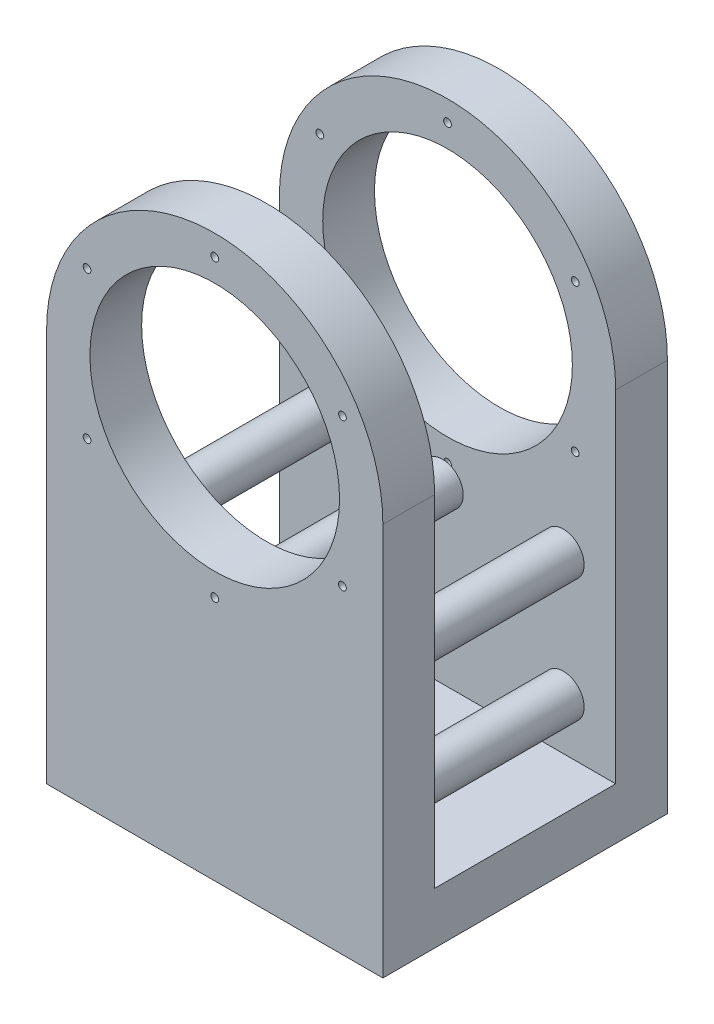
ISO-10303-21;
HEADER;
FILE_DESCRIPTION(('STEP AP214'),'2;1');
FILE_NAME('part.step','',(''),(''),'','','');
FILE_SCHEMA(('AUTOMOTIVE_DESIGN { 1 0 10303 214 1 1 1 1 }'));
ENDSEC;
DATA;
#1=APPLICATION_CONTEXT('core data for automotive mechanical design processes');
#2=APPLICATION_PROTOCOL_DEFINITION('international standard','automotive_design',2000,#1);
#3=PRODUCT_CONTEXT('',#1,'mechanical');
#4=PRODUCT('Part','Part','',(#3));
#5=PRODUCT_RELATED_PRODUCT_CATEGORY('part','',(#4));
#6=PRODUCT_DEFINITION_FORMATION('','',#4);
#7=PRODUCT_DEFINITION_CONTEXT('part definition',#1,'design');
#8=PRODUCT_DEFINITION('design','',#6,#7);
#9=PRODUCT_DEFINITION_SHAPE('','',#8);
#10=(LENGTH_UNIT() NAMED_UNIT(*) SI_UNIT(.MILLI.,.METRE.));
#11=(NAMED_UNIT(*) PLANE_ANGLE_UNIT() SI_UNIT($,.RADIAN.));
#12=(NAMED_UNIT(*) SI_UNIT($,.STERADIAN.) SOLID_ANGLE_UNIT());
#13=UNCERTAINTY_MEASURE_WITH_UNIT(LENGTH_MEASURE(1.E-05),#10,'distance_accuracy_value','');
#14=(GEOMETRIC_REPRESENTATION_CONTEXT(3) GLOBAL_UNCERTAINTY_ASSIGNED_CONTEXT((#13)) GLOBAL_UNIT_ASSIGNED_CONTEXT((#10,
#11,#12)) REPRESENTATION_CONTEXT('',''));
#15=CARTESIAN_POINT('',(0.,0.,0.));
#16=DIRECTION('',(0.,0.,1.));
#17=DIRECTION('',(1.,0.,0.));
#18=AXIS2_PLACEMENT_3D('',#15,#16,#17);
#19=CARTESIAN_POINT('',(0.,-103.525908009908,20.));
#20=DIRECTION('',(0.,0.,1.));
#21=DIRECTION('',(1.,0.,0.));
#22=AXIS2_PLACEMENT_3D('',#19,#20,#21);
#23=PLANE('',#22);
#24=CARTESIAN_POINT('',(0.,177.208570031155,20.));
#25=DIRECTION('',(0.,0.,-1.));
#26=DIRECTION('',(-1.,0.,0.));
#27=AXIS2_PLACEMENT_3D('',#24,#25,#26);
#28=CIRCLE('',#27,1.5);
#29=CARTESIAN_POINT('',(-1.5,177.208570031155,20.));
#30=VERTEX_POINT('',#29);
#31=EDGE_CURVE('E739',#30,#30,#28,.T.);
#32=ORIENTED_EDGE('',*,*,#31,.T.);
#33=EDGE_LOOP('',(#32));
#34=FACE_BOUND('',#33,.T.);
#35=CARTESIAN_POINT('',(49.3634480157114,148.708570031153,20.));
#36=DIRECTION('',(0.,0.,-1.));
#37=DIRECTION('',(-1.,0.,0.));
#38=AXIS2_PLACEMENT_3D('',#35,#36,#37);
#39=CIRCLE('',#38,1.5);
#40=CARTESIAN_POINT('',(47.8634480157114,148.708570031153,20.));
#41=VERTEX_POINT('',#40);
#42=EDGE_CURVE('E791',#41,#41,#39,.T.);
#43=ORIENTED_EDGE('',*,*,#42,.T.);
#44=EDGE_LOOP('',(#43));
#45=FACE_BOUND('',#44,.T.);
#46=CARTESIAN_POINT('',(49.3634480157096,91.7085700311531,20.));
#47=DIRECTION('',(0.,0.,-1.));
#48=DIRECTION('',(-1.,0.,0.));
#49=AXIS2_PLACEMENT_3D('',#46,#47,#48);
#50=CIRCLE('',#49,1.5);
#51=CARTESIAN_POINT('',(47.8634480157096,91.7085700311531,20.));
#52=VERTEX_POINT('',#51);
#53=EDGE_CURVE('E758',#52,#52,#50,.T.);
#54=ORIENTED_EDGE('',*,*,#53,.T.);
#55=EDGE_LOOP('',(#54));
#56=FACE_BOUND('',#55,.T.);
#57=CARTESIAN_POINT('',(-4.43416149295041E-12,63.2085700311548,20.));
#58=DIRECTION('',(0.,0.,-1.));
#59=DIRECTION('',(-1.,0.,0.));
#60=AXIS2_PLACEMENT_3D('',#57,#58,#59);
#61=CIRCLE('',#60,1.5);
#62=CARTESIAN_POINT('',(-1.50000000000444,63.2085700311548,20.));
#63=VERTEX_POINT('',#62);
#64=EDGE_CURVE('E767',#63,#63,#61,.T.);
#65=ORIENTED_EDGE('',*,*,#64,.T.);
#66=EDGE_LOOP('',(#65));
#67=FACE_BOUND('',#66,.T.);
#68=CARTESIAN_POINT('',(-49.3634480157165,91.7085700311566,20.));
#69=DIRECTION('',(0.,0.,-1.));
#70=DIRECTION('',(-1.,0.,0.));
#71=AXIS2_PLACEMENT_3D('',#68,#69,#70);
#72=CIRCLE('',#71,1.50000000000002);
#73=CARTESIAN_POINT('',(-50.8634480157165,91.7085700311566,20.));
#74=VERTEX_POINT('',#73);
#75=EDGE_CURVE('E774',#74,#74,#72,.T.);
#76=ORIENTED_EDGE('',*,*,#75,.T.);
#77=EDGE_LOOP('',(#76));
#78=FACE_BOUND('',#77,.T.);
#79=CARTESIAN_POINT('',(-49.3634480157143,148.708570031157,20.));
#80=DIRECTION('',(0.,0.,-1.));
#81=DIRECTION('',(-1.,0.,0.));
#82=AXIS2_PLACEMENT_3D('',#79,#80,#81);
#83=CIRCLE('',#82,1.49999999999999);
#84=CARTESIAN_POINT('',(-50.8634480157142,148.708570031157,20.));
#85=VERTEX_POINT('',#84);
#86=EDGE_CURVE('E782',#85,#85,#83,.T.);
#87=ORIENTED_EDGE('',*,*,#86,.T.);
#88=EDGE_LOOP('',(#87));
#89=FACE_BOUND('',#88,.T.);
#90=CARTESIAN_POINT('',(0.,120.208570031155,20.));
#91=DIRECTION('',(0.,0.,1.));
#92=DIRECTION('',(1.,0.,0.));
#93=AXIS2_PLACEMENT_3D('',#90,#91,#92);
#94=CIRCLE('',#93,48.25);
#95=CARTESIAN_POINT('',(48.25,120.208570031155,20.));
#96=VERTEX_POINT('',#95);
#97=EDGE_CURVE('E175',#96,#96,#94,.T.);
#98=ORIENTED_EDGE('',*,*,#97,.F.);
#99=EDGE_LOOP('',(#98));
#100=FACE_BOUND('',#99,.T.);
#101=DIRECTION('',(0.,-1.,0.));
#102=VECTOR('',#101,1.);
#103=CARTESIAN_POINT('',(-65.,-103.525908009908,20.));
#104=LINE('',#103,#102);
#105=CARTESIAN_POINT('',(-65.,120.208570031155,20.));
#106=VERTEX_POINT('',#105);
#107=CARTESIAN_POINT('',(-65.,-31.65707978,20.));
#108=VERTEX_POINT('',#107);
#109=EDGE_CURVE('E190',#106,#108,#104,.T.);
#110=ORIENTED_EDGE('',*,*,#109,.T.);
#111=DIRECTION('',(1.,0.,0.));
#112=VECTOR('',#111,1.);
#113=CARTESIAN_POINT('',(0.,-31.65707978,20.));
#114=LINE('',#113,#112);
#115=CARTESIAN_POINT('',(65.,-31.65707978,20.));
#116=VERTEX_POINT('',#115);
#117=EDGE_CURVE('E253',#108,#116,#114,.T.);
#118=ORIENTED_EDGE('',*,*,#117,.T.);
#119=DIRECTION('',(0.,1.,0.));
#120=VECTOR('',#119,1.);
#121=CARTESIAN_POINT('',(65.,-103.525908009908,20.));
#122=LINE('',#121,#120);
#123=CARTESIAN_POINT('',(65.,120.208570031155,20.));
#124=VERTEX_POINT('',#123);
#125=EDGE_CURVE('E183',#116,#124,#122,.T.);
#126=ORIENTED_EDGE('',*,*,#125,.T.);
#127=CARTESIAN_POINT('',(0.,120.208570031155,20.));
#128=DIRECTION('',(0.,0.,1.));
#129=DIRECTION('',(-1.,0.,0.));
#130=AXIS2_PLACEMENT_3D('',#127,#128,#129);
#131=CIRCLE('',#130,65.);
#132=EDGE_CURVE('E186',#124,#106,#131,.T.);
#133=ORIENTED_EDGE('',*,*,#132,.T.);
#134=EDGE_LOOP('',(#110,#118,#126,#133));
#135=FACE_BOUND('',#134,.T.);
#136=ADVANCED_FACE('F59',(#34,#45,#56,#67,#78,#89,#100,#135),#23,.T.);
#137=CARTESIAN_POINT('',(0.,-103.525908009908,0.));
#138=DIRECTION('',(0.,0.,1.));
#139=DIRECTION('',(1.,0.,0.));
#140=AXIS2_PLACEMENT_3D('',#137,#138,#139);
#141=PLANE('',#140);
#142=CARTESIAN_POINT('',(0.,177.208570031155,0.));
#143=DIRECTION('',(0.,0.,-1.));
#144=DIRECTION('',(-1.,0.,0.));
#145=AXIS2_PLACEMENT_3D('',#142,#143,#144);
#146=CIRCLE('',#145,1.5);
#147=CARTESIAN_POINT('',(-1.5,177.208570031155,0.));
#148=VERTEX_POINT('',#147);
#149=EDGE_CURVE('E790',#148,#148,#146,.T.);
#150=ORIENTED_EDGE('',*,*,#149,.F.);
#151=EDGE_LOOP('',(#150));
#152=FACE_BOUND('',#151,.T.);
#153=CARTESIAN_POINT('',(49.3634480157114,148.708570031153,0.));
#154=DIRECTION('',(0.,0.,-1.));
#155=DIRECTION('',(-1.,0.,0.));
#156=AXIS2_PLACEMENT_3D('',#153,#154,#155);
#157=CIRCLE('',#156,1.5);
#158=CARTESIAN_POINT('',(47.8634480157114,148.708570031153,0.));
#159=VERTEX_POINT('',#158);
#160=EDGE_CURVE('E763',#159,#159,#157,.T.);
#161=ORIENTED_EDGE('',*,*,#160,.F.);
#162=EDGE_LOOP('',(#161));
#163=FACE_BOUND('',#162,.T.);
#164=CARTESIAN_POINT('',(49.3634480157096,91.7085700311531,0.));
#165=DIRECTION('',(0.,0.,-1.));
#166=DIRECTION('',(-1.,0.,0.));
#167=AXIS2_PLACEMENT_3D('',#164,#165,#166);
#168=CIRCLE('',#167,1.5);
#169=CARTESIAN_POINT('',(47.8634480157096,91.7085700311531,0.));
#170=VERTEX_POINT('',#169);
#171=EDGE_CURVE('E762',#170,#170,#168,.T.);
#172=ORIENTED_EDGE('',*,*,#171,.F.);
#173=EDGE_LOOP('',(#172));
#174=FACE_BOUND('',#173,.T.);
#175=CARTESIAN_POINT('',(-49.3634480157165,91.7085700311566,0.));
#176=DIRECTION('',(0.,0.,-1.));
#177=DIRECTION('',(-1.,0.,0.));
#178=AXIS2_PLACEMENT_3D('',#175,#176,#177);
#179=CIRCLE('',#178,1.50000000000002);
#180=CARTESIAN_POINT('',(-50.8634480157165,91.7085700311566,0.));
#181=VERTEX_POINT('',#180);
#182=EDGE_CURVE('E778',#181,#181,#179,.T.);
#183=ORIENTED_EDGE('',*,*,#182,.F.);
#184=EDGE_LOOP('',(#183));
#185=FACE_BOUND('',#184,.T.);
#186=CARTESIAN_POINT('',(-49.3634480157143,148.708570031157,0.));
#187=DIRECTION('',(0.,0.,-1.));
#188=DIRECTION('',(-1.,0.,0.));
#189=AXIS2_PLACEMENT_3D('',#186,#187,#188);
#190=CIRCLE('',#189,1.49999999999999);
#191=CARTESIAN_POINT('',(-50.8634480157142,148.708570031157,0.));
#192=VERTEX_POINT('',#191);
#193=EDGE_CURVE('E786',#192,#192,#190,.T.);
#194=ORIENTED_EDGE('',*,*,#193,.F.);
#195=EDGE_LOOP('',(#194));
#196=FACE_BOUND('',#195,.T.);
#197=CARTESIAN_POINT('',(0.,120.208570031155,0.));
#198=DIRECTION('',(0.,0.,1.));
#199=DIRECTION('',(1.,0.,0.));
#200=AXIS2_PLACEMENT_3D('',#197,#198,#199);
#201=CIRCLE('',#200,48.25);
#202=CARTESIAN_POINT('',(48.25,120.208570031155,0.));
#203=VERTEX_POINT('',#202);
#204=EDGE_CURVE('E174',#203,#203,#201,.T.);
#205=ORIENTED_EDGE('',*,*,#204,.T.);
#206=EDGE_LOOP('',(#205));
#207=FACE_BOUND('',#206,.T.);
#208=CARTESIAN_POINT('',(44.8125688289735,55.5314901674792,0.));
#209=DIRECTION('',(0.,0.,1.));
#210=DIRECTION('',(1.,0.,0.));
#211=AXIS2_PLACEMENT_3D('',#208,#209,#210);
#212=CIRCLE('',#211,8.);
#213=CARTESIAN_POINT('',(52.8125688289735,55.5314901674792,0.));
#214=VERTEX_POINT('',#213);
#215=EDGE_CURVE('E210',#214,#214,#212,.F.);
#216=ORIENTED_EDGE('',*,*,#215,.F.);
#217=EDGE_LOOP('',(#216));
#218=FACE_BOUND('',#217,.T.);
#219=CARTESIAN_POINT('',(-48.6600829128466,55.5314901674792,0.));
#220=DIRECTION('',(0.,0.,1.));
#221=DIRECTION('',(1.,0.,0.));
#222=AXIS2_PLACEMENT_3D('',#219,#220,#221);
#223=CIRCLE('',#222,8.);
#224=CARTESIAN_POINT('',(-40.6600829128466,55.5314901674792,0.));
#225=VERTEX_POINT('',#224);
#226=EDGE_CURVE('E214',#225,#225,#223,.F.);
#227=ORIENTED_EDGE('',*,*,#226,.F.);
#228=EDGE_LOOP('',(#227));
#229=FACE_BOUND('',#228,.T.);
#230=CARTESIAN_POINT('',(-1.92375704193651,55.5314901674792,0.));
#231=DIRECTION('',(0.,0.,1.));
#232=DIRECTION('',(1.,0.,0.));
#233=AXIS2_PLACEMENT_3D('',#230,#231,#232);
#234=CIRCLE('',#233,8.);
#235=CARTESIAN_POINT('',(1.44035229725961,62.7897797975459,0.));
#236=VERTEX_POINT('',#235);
#237=CARTESIAN_POINT('',(-1.46763682096476,63.5184767296327,0.));
#238=VERTEX_POINT('',#237);
#239=EDGE_CURVE('E218',#236,#238,#234,.F.);
#240=ORIENTED_EDGE('',*,*,#239,.F.);
#241=CARTESIAN_POINT('',(-4.43416149295041E-12,63.2085700311548,0.));
#242=DIRECTION('',(0.,0.,-1.));
#243=DIRECTION('',(-1.,0.,0.));
#244=AXIS2_PLACEMENT_3D('',#241,#242,#243);
#245=CIRCLE('',#244,1.5);
#246=EDGE_CURVE('E81',#238,#236,#245,.T.);
#247=ORIENTED_EDGE('',*,*,#246,.F.);
#248=EDGE_LOOP('',(#240,#247));
#249=FACE_BOUND('',#248,.T.);
#250=CARTESIAN_POINT('',(44.8125688289736,7.9372051937396,0.));
#251=DIRECTION('',(0.,0.,1.));
#252=DIRECTION('',(1.,0.,0.));
#253=AXIS2_PLACEMENT_3D('',#250,#251,#252);
#254=CIRCLE('',#253,8.);
#255=CARTESIAN_POINT('',(52.8125688289736,7.9372051937396,0.));
#256=VERTEX_POINT('',#255);
#257=EDGE_CURVE('E68',#256,#256,#254,.F.);
#258=ORIENTED_EDGE('',*,*,#257,.F.);
#259=EDGE_LOOP('',(#258));
#260=FACE_BOUND('',#259,.T.);
#261=CARTESIAN_POINT('',(-48.6600829128466,7.9372051937396,0.));
#262=DIRECTION('',(0.,0.,1.));
#263=DIRECTION('',(1.,0.,0.));
#264=AXIS2_PLACEMENT_3D('',#261,#262,#263);
#265=CIRCLE('',#264,8.);
#266=CARTESIAN_POINT('',(-40.6600829128466,7.9372051937396,0.));
#267=VERTEX_POINT('',#266);
#268=EDGE_CURVE('E12',#267,#267,#265,.F.);
#269=ORIENTED_EDGE('',*,*,#268,.F.);
#270=EDGE_LOOP('',(#269));
#271=FACE_BOUND('',#270,.T.);
#272=DIRECTION('',(0.,1.,0.));
#273=VECTOR('',#272,1.);
#274=CARTESIAN_POINT('',(65.,-103.525908009908,0.));
#275=LINE('',#274,#273);
#276=CARTESIAN_POINT('',(65.,-11.65707978,0.));
#277=VERTEX_POINT('',#276);
#278=CARTESIAN_POINT('',(65.,120.208570031155,0.));
#279=VERTEX_POINT('',#278);
#280=EDGE_CURVE('E179',#277,#279,#275,.T.);
#281=ORIENTED_EDGE('',*,*,#280,.F.);
#282=DIRECTION('',(-1.,0.,0.));
#283=VECTOR('',#282,1.);
#284=CARTESIAN_POINT('',(65.,-11.65707978,0.));
#285=LINE('',#284,#283);
#286=CARTESIAN_POINT('',(-65.,-11.65707978,0.));
#287=VERTEX_POINT('',#286);
#288=EDGE_CURVE('E240',#277,#287,#285,.T.);
#289=ORIENTED_EDGE('',*,*,#288,.T.);
#290=DIRECTION('',(0.,-1.,0.));
#291=VECTOR('',#290,1.);
#292=CARTESIAN_POINT('',(-65.,-103.525908009908,0.));
#293=LINE('',#292,#291);
#294=CARTESIAN_POINT('',(-65.,120.208570031155,0.));
#295=VERTEX_POINT('',#294);
#296=EDGE_CURVE('E187',#295,#287,#293,.T.);
#297=ORIENTED_EDGE('',*,*,#296,.F.);
#298=CARTESIAN_POINT('',(0.,120.208570031155,0.));
#299=DIRECTION('',(0.,0.,1.));
#300=DIRECTION('',(-1.,0.,0.));
#301=AXIS2_PLACEMENT_3D('',#298,#299,#300);
#302=CIRCLE('',#301,65.);
#303=EDGE_CURVE('E197',#279,#295,#302,.T.);
#304=ORIENTED_EDGE('',*,*,#303,.F.);
#305=EDGE_LOOP('',(#281,#289,#297,#304));
#306=FACE_BOUND('',#305,.T.);
#307=ADVANCED_FACE('F228',(#152,#163,#174,#185,#196,#207,#218,#229,#249,#260,#271,#306),#141,.F.);
#308=CARTESIAN_POINT('',(0.,-103.525908009908,-90.));
#309=DIRECTION('',(0.,0.,-1.));
#310=DIRECTION('',(-1.,0.,0.));
#311=AXIS2_PLACEMENT_3D('',#308,#309,#310);
#312=PLANE('',#311);
#313=CARTESIAN_POINT('',(49.3634480157096,91.7085700311531,-90.));
#314=DIRECTION('',(0.,0.,1.));
#315=DIRECTION('',(1.,0.,0.));
#316=AXIS2_PLACEMENT_3D('',#313,#314,#315);
#317=CIRCLE('',#316,1.5);
#318=CARTESIAN_POINT('',(50.8634480157096,91.7085700311531,-90.));
#319=VERTEX_POINT('',#318);
#320=EDGE_CURVE('E812',#319,#319,#317,.T.);
#321=ORIENTED_EDGE('',*,*,#320,.T.);
#322=EDGE_LOOP('',(#321));
#323=FACE_BOUND('',#322,.T.);
#324=CARTESIAN_POINT('',(-49.3634480157165,91.7085700311566,-90.));
#325=DIRECTION('',(0.,0.,1.));
#326=DIRECTION('',(1.,0.,0.));
#327=AXIS2_PLACEMENT_3D('',#324,#325,#326);
#328=CIRCLE('',#327,1.50000000000002);
#329=CARTESIAN_POINT('',(-47.8634480157165,91.7085700311566,-90.));
#330=VERTEX_POINT('',#329);
#331=EDGE_CURVE('E820',#330,#330,#328,.T.);
#332=ORIENTED_EDGE('',*,*,#331,.T.);
#333=EDGE_LOOP('',(#332));
#334=FACE_BOUND('',#333,.T.);
#335=CARTESIAN_POINT('',(-4.43416149295041E-12,63.2085700311548,-90.));
#336=DIRECTION('',(0.,0.,1.));
#337=DIRECTION('',(1.,0.,0.));
#338=AXIS2_PLACEMENT_3D('',#335,#336,#337);
#339=CIRCLE('',#338,1.5);
#340=CARTESIAN_POINT('',(1.49999999999557,63.2085700311548,-90.));
#341=VERTEX_POINT('',#340);
#342=EDGE_CURVE('E156',#341,#341,#339,.T.);
#343=ORIENTED_EDGE('',*,*,#342,.T.);
#344=EDGE_LOOP('',(#343));
#345=FACE_BOUND('',#344,.T.);
#346=CARTESIAN_POINT('',(-49.3634480157143,148.708570031157,-90.));
#347=DIRECTION('',(0.,0.,1.));
#348=DIRECTION('',(1.,0.,0.));
#349=AXIS2_PLACEMENT_3D('',#346,#347,#348);
#350=CIRCLE('',#349,1.49999999999999);
#351=CARTESIAN_POINT('',(-47.8634480157143,148.708570031157,-90.));
#352=VERTEX_POINT('',#351);
#353=EDGE_CURVE('E150',#352,#352,#350,.T.);
#354=ORIENTED_EDGE('',*,*,#353,.T.);
#355=EDGE_LOOP('',(#354));
#356=FACE_BOUND('',#355,.T.);
#357=CARTESIAN_POINT('',(0.,177.208570031155,-90.));
#358=DIRECTION('',(0.,0.,1.));
#359=DIRECTION('',(1.,0.,0.));
#360=AXIS2_PLACEMENT_3D('',#357,#358,#359);
#361=CIRCLE('',#360,1.5);
#362=CARTESIAN_POINT('',(1.5,177.208570031155,-90.));
#363=VERTEX_POINT('',#362);
#364=EDGE_CURVE('E838',#363,#363,#361,.T.);
#365=ORIENTED_EDGE('',*,*,#364,.T.);
#366=EDGE_LOOP('',(#365));
#367=FACE_BOUND('',#366,.T.);
#368=CARTESIAN_POINT('',(49.3634480157114,148.708570031153,-90.));
#369=DIRECTION('',(0.,0.,1.));
#370=DIRECTION('',(1.,0.,0.));
#371=AXIS2_PLACEMENT_3D('',#368,#369,#370);
#372=CIRCLE('',#371,1.5);
#373=CARTESIAN_POINT('',(50.8634480157114,148.708570031153,-90.));
#374=VERTEX_POINT('',#373);
#375=EDGE_CURVE('E795',#374,#374,#372,.T.);
#376=ORIENTED_EDGE('',*,*,#375,.T.);
#377=EDGE_LOOP('',(#376));
#378=FACE_BOUND('',#377,.T.);
#379=CARTESIAN_POINT('',(0.,120.208570031155,-90.));
#380=DIRECTION('',(0.,0.,-1.));
#381=DIRECTION('',(-1.,0.,0.));
#382=AXIS2_PLACEMENT_3D('',#379,#380,#381);
#383=CIRCLE('',#382,48.25);
#384=CARTESIAN_POINT('',(-48.25,120.208570031155,-90.));
#385=VERTEX_POINT('',#384);
#386=EDGE_CURVE('E291',#385,#385,#383,.T.);
#387=ORIENTED_EDGE('',*,*,#386,.F.);
#388=EDGE_LOOP('',(#387));
#389=FACE_BOUND('',#388,.T.);
#390=DIRECTION('',(0.,-1.,0.));
#391=VECTOR('',#390,1.);
#392=CARTESIAN_POINT('',(65.,120.208570031155,-90.));
#393=LINE('',#392,#391);
#394=CARTESIAN_POINT('',(65.,120.208570031155,-90.));
#395=VERTEX_POINT('',#394);
#396=CARTESIAN_POINT('',(65.,-31.65707978,-90.));
#397=VERTEX_POINT('',#396);
#398=EDGE_CURVE('E259',#395,#397,#393,.T.);
#399=ORIENTED_EDGE('',*,*,#398,.T.);
#400=DIRECTION('',(1.,0.,0.));
#401=VECTOR('',#400,1.);
#402=CARTESIAN_POINT('',(0.,-31.65707978,-90.));
#403=LINE('',#402,#401);
#404=CARTESIAN_POINT('',(-65.,-31.65707978,-90.));
#405=VERTEX_POINT('',#404);
#406=EDGE_CURVE('E266',#405,#397,#403,.T.);
#407=ORIENTED_EDGE('',*,*,#406,.F.);
#408=DIRECTION('',(0.,1.,0.));
#409=VECTOR('',#408,1.);
#410=CARTESIAN_POINT('',(-65.,-103.525908009908,-90.));
#411=LINE('',#410,#409);
#412=CARTESIAN_POINT('',(-65.,120.208570031155,-90.));
#413=VERTEX_POINT('',#412);
#414=EDGE_CURVE('E283',#405,#413,#411,.T.);
#415=ORIENTED_EDGE('',*,*,#414,.T.);
#416=CARTESIAN_POINT('',(0.,120.208570031155,-90.));
#417=DIRECTION('',(0.,0.,-1.));
#418=DIRECTION('',(-1.,0.,0.));
#419=AXIS2_PLACEMENT_3D('',#416,#417,#418);
#420=CIRCLE('',#419,65.);
#421=EDGE_CURVE('E274',#413,#395,#420,.T.);
#422=ORIENTED_EDGE('',*,*,#421,.T.);
#423=EDGE_LOOP('',(#399,#407,#415,#422));
#424=FACE_BOUND('',#423,.T.);
#425=ADVANCED_FACE('F231',(#323,#334,#345,#356,#367,#378,#389,#424),#312,.T.);
#426=CARTESIAN_POINT('',(0.,-103.525908009908,-70.));
#427=DIRECTION('',(0.,0.,-1.));
#428=DIRECTION('',(-1.,0.,0.));
#429=AXIS2_PLACEMENT_3D('',#426,#427,#428);
#430=PLANE('',#429);
#431=CARTESIAN_POINT('',(49.3634480157096,91.7085700311531,-70.));
#432=DIRECTION('',(0.,0.,1.));
#433=DIRECTION('',(1.,0.,0.));
#434=AXIS2_PLACEMENT_3D('',#431,#432,#433);
#435=CIRCLE('',#434,1.5);
#436=CARTESIAN_POINT('',(50.8634480157096,91.7085700311531,-70.));
#437=VERTEX_POINT('',#436);
#438=EDGE_CURVE('E816',#437,#437,#435,.T.);
#439=ORIENTED_EDGE('',*,*,#438,.F.);
#440=EDGE_LOOP('',(#439));
#441=FACE_BOUND('',#440,.T.);
#442=CARTESIAN_POINT('',(-49.3634480157165,91.7085700311566,-70.));
#443=DIRECTION('',(0.,0.,1.));
#444=DIRECTION('',(1.,0.,0.));
#445=AXIS2_PLACEMENT_3D('',#442,#443,#444);
#446=CIRCLE('',#445,1.50000000000002);
#447=CARTESIAN_POINT('',(-47.8634480157165,91.7085700311566,-70.));
#448=VERTEX_POINT('',#447);
#449=EDGE_CURVE('E824',#448,#448,#446,.T.);
#450=ORIENTED_EDGE('',*,*,#449,.F.);
#451=EDGE_LOOP('',(#450));
#452=FACE_BOUND('',#451,.T.);
#453=CARTESIAN_POINT('',(-49.3634480157143,148.708570031157,-70.));
#454=DIRECTION('',(0.,0.,1.));
#455=DIRECTION('',(1.,0.,0.));
#456=AXIS2_PLACEMENT_3D('',#453,#454,#455);
#457=CIRCLE('',#456,1.49999999999999);
#458=CARTESIAN_POINT('',(-47.8634480157143,148.708570031157,-70.));
#459=VERTEX_POINT('',#458);
#460=EDGE_CURVE('E834',#459,#459,#457,.T.);
#461=ORIENTED_EDGE('',*,*,#460,.F.);
#462=EDGE_LOOP('',(#461));
#463=FACE_BOUND('',#462,.T.);
#464=CARTESIAN_POINT('',(0.,177.208570031155,-70.));
#465=DIRECTION('',(0.,0.,1.));
#466=DIRECTION('',(1.,0.,0.));
#467=AXIS2_PLACEMENT_3D('',#464,#465,#466);
#468=CIRCLE('',#467,1.5);
#469=CARTESIAN_POINT('',(1.5,177.208570031155,-70.));
#470=VERTEX_POINT('',#469);
#471=EDGE_CURVE('E808',#470,#470,#468,.T.);
#472=ORIENTED_EDGE('',*,*,#471,.F.);
#473=EDGE_LOOP('',(#472));
#474=FACE_BOUND('',#473,.T.);
#475=CARTESIAN_POINT('',(49.3634480157114,148.708570031153,-70.));
#476=DIRECTION('',(0.,0.,1.));
#477=DIRECTION('',(1.,0.,0.));
#478=AXIS2_PLACEMENT_3D('',#475,#476,#477);
#479=CIRCLE('',#478,1.5);
#480=CARTESIAN_POINT('',(50.8634480157114,148.708570031153,-70.));
#481=VERTEX_POINT('',#480);
#482=EDGE_CURVE('E804',#481,#481,#479,.T.);
#483=ORIENTED_EDGE('',*,*,#482,.F.);
#484=EDGE_LOOP('',(#483));
#485=FACE_BOUND('',#484,.T.);
#486=CARTESIAN_POINT('',(0.,120.208570031155,-70.));
#487=DIRECTION('',(0.,0.,-1.));
#488=DIRECTION('',(-1.,0.,0.));
#489=AXIS2_PLACEMENT_3D('',#486,#487,#488);
#490=CIRCLE('',#489,48.25);
#491=CARTESIAN_POINT('',(-48.25,120.208570031155,-70.));
#492=VERTEX_POINT('',#491);
#493=EDGE_CURVE('E262',#492,#492,#490,.T.);
#494=ORIENTED_EDGE('',*,*,#493,.T.);
#495=EDGE_LOOP('',(#494));
#496=FACE_BOUND('',#495,.T.);
#497=CARTESIAN_POINT('',(-48.6600829128466,7.9372051937396,-70.));
#498=DIRECTION('',(0.,0.,-1.));
#499=DIRECTION('',(-1.,0.,0.));
#500=AXIS2_PLACEMENT_3D('',#497,#498,#499);
#501=CIRCLE('',#500,8.);
#502=CARTESIAN_POINT('',(-56.6600829128466,7.9372051937396,-70.));
#503=VERTEX_POINT('',#502);
#504=EDGE_CURVE('E163',#503,#503,#501,.T.);
#505=ORIENTED_EDGE('',*,*,#504,.T.);
#506=EDGE_LOOP('',(#505));
#507=FACE_BOUND('',#506,.T.);
#508=CARTESIAN_POINT('',(44.8125688289736,7.9372051937396,-70.));
#509=DIRECTION('',(0.,0.,-1.));
#510=DIRECTION('',(-1.,0.,0.));
#511=AXIS2_PLACEMENT_3D('',#508,#509,#510);
#512=CIRCLE('',#511,8.);
#513=CARTESIAN_POINT('',(36.8125688289736,7.9372051937396,-70.));
#514=VERTEX_POINT('',#513);
#515=EDGE_CURVE('E160',#514,#514,#512,.T.);
#516=ORIENTED_EDGE('',*,*,#515,.T.);
#517=EDGE_LOOP('',(#516));
#518=FACE_BOUND('',#517,.T.);
#519=CARTESIAN_POINT('',(-1.92375704193651,55.5314901674792,-70.));
#520=DIRECTION('',(0.,0.,-1.));
#521=DIRECTION('',(-1.,0.,0.));
#522=AXIS2_PLACEMENT_3D('',#519,#520,#521);
#523=CIRCLE('',#522,8.);
#524=CARTESIAN_POINT('',(1.44035229725961,62.7897797975459,-70.));
#525=VERTEX_POINT('',#524);
#526=CARTESIAN_POINT('',(-1.46763682096476,63.5184767296327,-70.));
#527=VERTEX_POINT('',#526);
#528=EDGE_CURVE('E142',#525,#527,#523,.T.);
#529=ORIENTED_EDGE('',*,*,#528,.T.);
#530=CARTESIAN_POINT('',(-4.43416149295041E-12,63.2085700311548,-70.));
#531=DIRECTION('',(0.,0.,1.));
#532=DIRECTION('',(1.,0.,0.));
#533=AXIS2_PLACEMENT_3D('',#530,#531,#532);
#534=CIRCLE('',#533,1.5);
#535=EDGE_CURVE('E147',#525,#527,#534,.T.);
#536=ORIENTED_EDGE('',*,*,#535,.F.);
#537=EDGE_LOOP('',(#529,#536));
#538=FACE_BOUND('',#537,.T.);
#539=CARTESIAN_POINT('',(-48.6600829128466,55.5314901674792,-70.));
#540=DIRECTION('',(0.,0.,-1.));
#541=DIRECTION('',(-1.,0.,0.));
#542=AXIS2_PLACEMENT_3D('',#539,#540,#541);
#543=CIRCLE('',#542,8.);
#544=CARTESIAN_POINT('',(-56.6600829128466,55.5314901674792,-70.));
#545=VERTEX_POINT('',#544);
#546=EDGE_CURVE('E141',#545,#545,#543,.T.);
#547=ORIENTED_EDGE('',*,*,#546,.T.);
#548=EDGE_LOOP('',(#547));
#549=FACE_BOUND('',#548,.T.);
#550=CARTESIAN_POINT('',(44.8125688289735,55.5314901674792,-70.));
#551=DIRECTION('',(0.,0.,-1.));
#552=DIRECTION('',(-1.,0.,0.));
#553=AXIS2_PLACEMENT_3D('',#550,#551,#552);
#554=CIRCLE('',#553,8.);
#555=CARTESIAN_POINT('',(36.8125688289735,55.5314901674792,-70.));
#556=VERTEX_POINT('',#555);
#557=EDGE_CURVE('E170',#556,#556,#554,.T.);
#558=ORIENTED_EDGE('',*,*,#557,.T.);
#559=EDGE_LOOP('',(#558));
#560=FACE_BOUND('',#559,.T.);
#561=DIRECTION('',(0.,1.,0.));
#562=VECTOR('',#561,1.);
#563=CARTESIAN_POINT('',(-65.,-103.525908009908,-70.));
#564=LINE('',#563,#562);
#565=CARTESIAN_POINT('',(-65.,-11.65707978,-70.));
#566=VERTEX_POINT('',#565);
#567=CARTESIAN_POINT('',(-65.,120.208570031155,-70.));
#568=VERTEX_POINT('',#567);
#569=EDGE_CURVE('E287',#566,#568,#564,.T.);
#570=ORIENTED_EDGE('',*,*,#569,.F.);
#571=DIRECTION('',(-1.,0.,0.));
#572=VECTOR('',#571,1.);
#573=CARTESIAN_POINT('',(65.,-11.65707978,-70.));
#574=LINE('',#573,#572);
#575=CARTESIAN_POINT('',(65.,-11.65707978,-70.));
#576=VERTEX_POINT('',#575);
#577=EDGE_CURVE('E694',#576,#566,#574,.T.);
#578=ORIENTED_EDGE('',*,*,#577,.F.);
#579=DIRECTION('',(0.,-1.,0.));
#580=VECTOR('',#579,1.);
#581=CARTESIAN_POINT('',(65.,120.208570031155,-70.));
#582=LINE('',#581,#580);
#583=CARTESIAN_POINT('',(65.,120.208570031155,-70.));
#584=VERTEX_POINT('',#583);
#585=EDGE_CURVE('E294',#584,#576,#582,.T.);
#586=ORIENTED_EDGE('',*,*,#585,.F.);
#587=CARTESIAN_POINT('',(0.,120.208570031155,-70.));
#588=DIRECTION('',(0.,0.,-1.));
#589=DIRECTION('',(-1.,0.,0.));
#590=AXIS2_PLACEMENT_3D('',#587,#588,#589);
#591=CIRCLE('',#590,65.);
#592=EDGE_CURVE('E290',#568,#584,#591,.T.);
#593=ORIENTED_EDGE('',*,*,#592,.F.);
#594=EDGE_LOOP('',(#570,#578,#586,#593));
#595=FACE_BOUND('',#594,.T.);
#596=ADVANCED_FACE('F153',(#441,#452,#463,#474,#485,#496,#507,#518,#538,#549,#560,#595),#430,.F.);
#597=CARTESIAN_POINT('',(-65.,-103.525908009908,-90.));
#598=DIRECTION('',(1.,0.,0.));
#599=DIRECTION('',(0.,0.,-1.));
#600=AXIS2_PLACEMENT_3D('',#597,#598,#599);
#601=PLANE('',#600);
#602=ORIENTED_EDGE('',*,*,#414,.F.);
#603=DIRECTION('',(0.,0.,1.));
#604=VECTOR('',#603,1.);
#605=CARTESIAN_POINT('',(-65.,-31.65707978,-90.));
#606=LINE('',#605,#604);
#607=EDGE_CURVE('E263',#405,#108,#606,.T.);
#608=ORIENTED_EDGE('',*,*,#607,.T.);
#609=ORIENTED_EDGE('',*,*,#109,.F.);
#610=DIRECTION('',(0.,0.,-1.));
#611=VECTOR('',#610,1.);
#612=CARTESIAN_POINT('',(-65.,120.208570031155,20.));
#613=LINE('',#612,#611);
#614=EDGE_CURVE('E194',#106,#295,#613,.T.);
#615=ORIENTED_EDGE('',*,*,#614,.T.);
#616=ORIENTED_EDGE('',*,*,#296,.T.);
#617=DIRECTION('',(0.,0.,1.));
#618=VECTOR('',#617,1.);
#619=CARTESIAN_POINT('',(-65.,-11.65707978,-201.529464379659));
#620=LINE('',#619,#618);
#621=EDGE_CURVE('E697',#566,#287,#620,.T.);
#622=ORIENTED_EDGE('',*,*,#621,.F.);
#623=ORIENTED_EDGE('',*,*,#569,.T.);
#624=DIRECTION('',(0.,0.,1.));
#625=VECTOR('',#624,1.);
#626=CARTESIAN_POINT('',(-65.,120.208570031155,-90.));
#627=LINE('',#626,#625);
#628=EDGE_CURVE('E281',#413,#568,#627,.T.);
#629=ORIENTED_EDGE('',*,*,#628,.F.);
#630=EDGE_LOOP('',(#602,#608,#609,#615,#616,#622,#623,#629));
#631=FACE_BOUND('',#630,.T.);
#632=ADVANCED_FACE('F578',(#631),#601,.F.);
#633=CARTESIAN_POINT('',(65.,120.208570031155,-90.));
#634=DIRECTION('',(-1.,0.,0.));
#635=DIRECTION('',(0.,0.,1.));
#636=AXIS2_PLACEMENT_3D('',#633,#634,#635);
#637=PLANE('',#636);
#638=DIRECTION('',(0.,0.,1.));
#639=VECTOR('',#638,1.);
#640=CARTESIAN_POINT('',(65.,-31.65707978,-90.));
#641=LINE('',#640,#639);
#642=EDGE_CURVE('E255',#397,#116,#641,.T.);
#643=ORIENTED_EDGE('',*,*,#642,.F.);
#644=ORIENTED_EDGE('',*,*,#398,.F.);
#645=DIRECTION('',(0.,0.,1.));
#646=VECTOR('',#645,1.);
#647=CARTESIAN_POINT('',(65.,120.208570031155,-90.));
#648=LINE('',#647,#646);
#649=EDGE_CURVE('E277',#395,#584,#648,.T.);
#650=ORIENTED_EDGE('',*,*,#649,.T.);
#651=ORIENTED_EDGE('',*,*,#585,.T.);
#652=DIRECTION('',(0.,0.,1.));
#653=VECTOR('',#652,1.);
#654=CARTESIAN_POINT('',(65.,-11.65707978,-201.529464379659));
#655=LINE('',#654,#653);
#656=EDGE_CURVE('E247',#576,#277,#655,.T.);
#657=ORIENTED_EDGE('',*,*,#656,.T.);
#658=ORIENTED_EDGE('',*,*,#280,.T.);
#659=DIRECTION('',(0.,0.,-1.));
#660=VECTOR('',#659,1.);
#661=CARTESIAN_POINT('',(65.,120.208570031155,20.));
#662=LINE('',#661,#660);
#663=EDGE_CURVE('E206',#124,#279,#662,.T.);
#664=ORIENTED_EDGE('',*,*,#663,.F.);
#665=ORIENTED_EDGE('',*,*,#125,.F.);
#666=EDGE_LOOP('',(#643,#644,#650,#651,#657,#658,#664,#665));
#667=FACE_BOUND('',#666,.T.);
#668=ADVANCED_FACE('F243',(#667),#637,.F.);
#669=CARTESIAN_POINT('',(0.,120.208570031155,20.));
#670=DIRECTION('',(0.,0.,-1.));
#671=DIRECTION('',(-1.,0.,0.));
#672=AXIS2_PLACEMENT_3D('',#669,#670,#671);
#673=CYLINDRICAL_SURFACE('',#672,65.);
#674=ORIENTED_EDGE('',*,*,#303,.T.);
#675=ORIENTED_EDGE('',*,*,#614,.F.);
#676=ORIENTED_EDGE('',*,*,#132,.F.);
#677=ORIENTED_EDGE('',*,*,#663,.T.);
#678=EDGE_LOOP('',(#674,#675,#676,#677));
#679=FACE_BOUND('',#678,.T.);
#680=ADVANCED_FACE('F61',(#679),#673,.T.);
#681=CARTESIAN_POINT('',(0.,120.208570031155,20.));
#682=DIRECTION('',(0.,0.,-1.));
#683=DIRECTION('',(-1.,0.,0.));
#684=AXIS2_PLACEMENT_3D('',#681,#682,#683);
#685=CYLINDRICAL_SURFACE('',#684,48.25);
#686=ORIENTED_EDGE('',*,*,#97,.T.);
#687=EDGE_LOOP('',(#686));
#688=FACE_BOUND('',#687,.T.);
#689=ORIENTED_EDGE('',*,*,#204,.F.);
#690=EDGE_LOOP('',(#689));
#691=FACE_BOUND('',#690,.T.);
#692=ADVANCED_FACE('F329',(#688,#691),#685,.F.);
#693=CARTESIAN_POINT('',(44.8125688289735,55.5314901674792,-70.));
#694=DIRECTION('',(0.,0.,1.));
#695=DIRECTION('',(1.,0.,0.));
#696=AXIS2_PLACEMENT_3D('',#693,#694,#695);
#697=CYLINDRICAL_SURFACE('',#696,8.);
#698=ORIENTED_EDGE('',*,*,#557,.F.);
#699=EDGE_LOOP('',(#698));
#700=FACE_BOUND('',#699,.T.);
#701=ORIENTED_EDGE('',*,*,#215,.T.);
#702=EDGE_LOOP('',(#701));
#703=FACE_BOUND('',#702,.T.);
#704=ADVANCED_FACE('F332',(#700,#703),#697,.T.);
#705=CARTESIAN_POINT('',(-48.6600829128466,55.5314901674792,-70.));
#706=DIRECTION('',(0.,0.,1.));
#707=DIRECTION('',(1.,0.,0.));
#708=AXIS2_PLACEMENT_3D('',#705,#706,#707);
#709=CYLINDRICAL_SURFACE('',#708,8.);
#710=ORIENTED_EDGE('',*,*,#546,.F.);
#711=EDGE_LOOP('',(#710));
#712=FACE_BOUND('',#711,.T.);
#713=ORIENTED_EDGE('',*,*,#226,.T.);
#714=EDGE_LOOP('',(#713));
#715=FACE_BOUND('',#714,.T.);
#716=ADVANCED_FACE('F336',(#712,#715),#709,.T.);
#717=CARTESIAN_POINT('',(-1.92375704193651,55.5314901674792,-70.));
#718=DIRECTION('',(0.,0.,1.));
#719=DIRECTION('',(1.,0.,0.));
#720=AXIS2_PLACEMENT_3D('',#717,#718,#719);
#721=CYLINDRICAL_SURFACE('',#720,8.);
#722=EDGE_CURVE('E136',#527,#525,#523,.T.);
#723=ORIENTED_EDGE('',*,*,#722,.F.);
#724=ORIENTED_EDGE('',*,*,#528,.F.);
#725=EDGE_LOOP('',(#723,#724));
#726=FACE_BOUND('',#725,.T.);
#727=EDGE_CURVE('E219',#238,#236,#234,.F.);
#728=ORIENTED_EDGE('',*,*,#727,.T.);
#729=ORIENTED_EDGE('',*,*,#239,.T.);
#730=EDGE_LOOP('',(#728,#729));
#731=FACE_BOUND('',#730,.T.);
#732=ADVANCED_FACE('F157',(#726,#731),#721,.T.);
#733=CARTESIAN_POINT('',(44.8125688289736,7.9372051937396,-70.));
#734=DIRECTION('',(0.,0.,1.));
#735=DIRECTION('',(1.,0.,0.));
#736=AXIS2_PLACEMENT_3D('',#733,#734,#735);
#737=CYLINDRICAL_SURFACE('',#736,8.);
#738=ORIENTED_EDGE('',*,*,#515,.F.);
#739=EDGE_LOOP('',(#738));
#740=FACE_BOUND('',#739,.T.);
#741=ORIENTED_EDGE('',*,*,#257,.T.);
#742=EDGE_LOOP('',(#741));
#743=FACE_BOUND('',#742,.T.);
#744=ADVANCED_FACE('F226',(#740,#743),#737,.T.);
#745=CARTESIAN_POINT('',(-48.6600829128466,7.9372051937396,-70.));
#746=DIRECTION('',(0.,0.,1.));
#747=DIRECTION('',(1.,0.,0.));
#748=AXIS2_PLACEMENT_3D('',#745,#746,#747);
#749=CYLINDRICAL_SURFACE('',#748,8.);
#750=ORIENTED_EDGE('',*,*,#504,.F.);
#751=EDGE_LOOP('',(#750));
#752=FACE_BOUND('',#751,.T.);
#753=ORIENTED_EDGE('',*,*,#268,.T.);
#754=EDGE_LOOP('',(#753));
#755=FACE_BOUND('',#754,.T.);
#756=ADVANCED_FACE('F305',(#752,#755),#749,.T.);
#757=CARTESIAN_POINT('',(0.,120.208570031155,-90.));
#758=DIRECTION('',(0.,0.,1.));
#759=DIRECTION('',(1.,0.,0.));
#760=AXIS2_PLACEMENT_3D('',#757,#758,#759);
#761=CYLINDRICAL_SURFACE('',#760,65.);
#762=ORIENTED_EDGE('',*,*,#592,.T.);
#763=ORIENTED_EDGE('',*,*,#649,.F.);
#764=ORIENTED_EDGE('',*,*,#421,.F.);
#765=ORIENTED_EDGE('',*,*,#628,.T.);
#766=EDGE_LOOP('',(#762,#763,#764,#765));
#767=FACE_BOUND('',#766,.T.);
#768=ADVANCED_FACE('F308',(#767),#761,.T.);
#769=CARTESIAN_POINT('',(0.,120.208570031155,-90.));
#770=DIRECTION('',(0.,0.,1.));
#771=DIRECTION('',(1.,0.,0.));
#772=AXIS2_PLACEMENT_3D('',#769,#770,#771);
#773=CYLINDRICAL_SURFACE('',#772,48.25);
#774=ORIENTED_EDGE('',*,*,#386,.T.);
#775=EDGE_LOOP('',(#774));
#776=FACE_BOUND('',#775,.T.);
#777=ORIENTED_EDGE('',*,*,#493,.F.);
#778=EDGE_LOOP('',(#777));
#779=FACE_BOUND('',#778,.T.);
#780=ADVANCED_FACE('F314',(#776,#779),#773,.F.);
#781=CARTESIAN_POINT('',(0.,-31.65707978,-90.));
#782=DIRECTION('',(0.,-1.,0.));
#783=DIRECTION('',(1.,0.,0.));
#784=AXIS2_PLACEMENT_3D('',#781,#782,#783);
#785=PLANE('',#784);
#786=CARTESIAN_POINT('',(-14.9389382152811,-31.65707978,-26.3750000000005));
#787=DIRECTION('',(0.,-1.,0.));
#788=DIRECTION('',(1.,0.,0.));
#789=AXIS2_PLACEMENT_3D('',#786,#787,#788);
#790=CIRCLE('',#789,1.65);
#791=CARTESIAN_POINT('',(-13.2889382152811,-31.65707978,-26.3750000000005));
#792=VERTEX_POINT('',#791);
#793=EDGE_CURVE('E729',#792,#792,#790,.F.);
#794=ORIENTED_EDGE('',*,*,#793,.T.);
#795=EDGE_LOOP('',(#794));
#796=FACE_BOUND('',#795,.T.);
#797=CARTESIAN_POINT('',(-14.9389382152806,-31.65707978,-43.6250000000005));
#798=DIRECTION('',(0.,-1.,0.));
#799=DIRECTION('',(1.,0.,0.));
#800=AXIS2_PLACEMENT_3D('',#797,#798,#799);
#801=CIRCLE('',#800,1.65);
#802=CARTESIAN_POINT('',(-13.2889382152806,-31.65707978,-43.6250000000005));
#803=VERTEX_POINT('',#802);
#804=EDGE_CURVE('E725',#803,#803,#801,.F.);
#805=ORIENTED_EDGE('',*,*,#804,.T.);
#806=EDGE_LOOP('',(#805));
#807=FACE_BOUND('',#806,.T.);
#808=CARTESIAN_POINT('',(1.33684809889072E-12,-31.65707978,-52.25));
#809=DIRECTION('',(0.,-1.,0.));
#810=DIRECTION('',(1.,0.,0.));
#811=AXIS2_PLACEMENT_3D('',#808,#809,#810);
#812=CIRCLE('',#811,1.65);
#813=CARTESIAN_POINT('',(1.65000000000134,-31.65707978,-52.25));
#814=VERTEX_POINT('',#813);
#815=EDGE_CURVE('E721',#814,#814,#812,.F.);
#816=ORIENTED_EDGE('',*,*,#815,.T.);
#817=EDGE_LOOP('',(#816));
#818=FACE_BOUND('',#817,.T.);
#819=CARTESIAN_POINT('',(14.9389382152826,-31.65707978,-43.6249999999994));
#820=DIRECTION('',(0.,-1.,0.));
#821=DIRECTION('',(1.,0.,0.));
#822=AXIS2_PLACEMENT_3D('',#819,#820,#821);
#823=CIRCLE('',#822,1.65);
#824=CARTESIAN_POINT('',(16.5889382152826,-31.65707978,-43.6249999999994));
#825=VERTEX_POINT('',#824);
#826=EDGE_CURVE('E717',#825,#825,#823,.F.);
#827=ORIENTED_EDGE('',*,*,#826,.T.);
#828=EDGE_LOOP('',(#827));
#829=FACE_BOUND('',#828,.T.);
#830=CARTESIAN_POINT('',(14.9389382152819,-31.65707978,-26.3749999999994));
#831=DIRECTION('',(0.,-1.,0.));
#832=DIRECTION('',(1.,0.,0.));
#833=AXIS2_PLACEMENT_3D('',#830,#831,#832);
#834=CIRCLE('',#833,1.65000000000001);
#835=CARTESIAN_POINT('',(16.588938215282,-31.65707978,-26.3749999999994));
#836=VERTEX_POINT('',#835);
#837=EDGE_CURVE('E713',#836,#836,#834,.F.);
#838=ORIENTED_EDGE('',*,*,#837,.T.);
#839=EDGE_LOOP('',(#838));
#840=FACE_BOUND('',#839,.T.);
#841=CARTESIAN_POINT('',(0.,-31.65707978,-17.75));
#842=DIRECTION('',(0.,-1.,0.));
#843=DIRECTION('',(1.,0.,0.));
#844=AXIS2_PLACEMENT_3D('',#841,#842,#843);
#845=CIRCLE('',#844,1.65);
#846=CARTESIAN_POINT('',(1.64999999999999,-31.65707978,-17.75));
#847=VERTEX_POINT('',#846);
#848=EDGE_CURVE('E702',#847,#847,#845,.F.);
#849=ORIENTED_EDGE('',*,*,#848,.T.);
#850=EDGE_LOOP('',(#849));
#851=FACE_BOUND('',#850,.T.);
#852=ORIENTED_EDGE('',*,*,#607,.F.);
#853=ORIENTED_EDGE('',*,*,#406,.T.);
#854=ORIENTED_EDGE('',*,*,#642,.T.);
#855=ORIENTED_EDGE('',*,*,#117,.F.);
#856=EDGE_LOOP('',(#852,#853,#854,#855));
#857=FACE_BOUND('',#856,.T.);
#858=ADVANCED_FACE('F267',(#796,#807,#818,#829,#840,#851,#857),#785,.T.);
#859=CARTESIAN_POINT('',(65.,-11.65707978,-201.529464379659));
#860=DIRECTION('',(0.,1.,0.));
#861=DIRECTION('',(0.,0.,1.));
#862=AXIS2_PLACEMENT_3D('',#859,#860,#861);
#863=PLANE('',#862);
#864=CARTESIAN_POINT('',(1.34005066530791E-12,-11.65707978,-52.25));
#865=DIRECTION('',(0.,1.,0.));
#866=DIRECTION('',(0.,0.,1.));
#867=AXIS2_PLACEMENT_3D('',#864,#865,#866);
#868=CIRCLE('',#867,1.65);
#869=CARTESIAN_POINT('',(1.34005066530791E-12,-11.65707978,-50.6));
#870=VERTEX_POINT('',#869);
#871=EDGE_CURVE('E733',#870,#870,#868,.F.);
#872=ORIENTED_EDGE('',*,*,#871,.T.);
#873=EDGE_LOOP('',(#872));
#874=FACE_BOUND('',#873,.T.);
#875=CARTESIAN_POINT('',(14.9389382152826,-11.65707978,-43.6249999999994));
#876=DIRECTION('',(0.,1.,0.));
#877=DIRECTION('',(0.,0.,1.));
#878=AXIS2_PLACEMENT_3D('',#875,#876,#877);
#879=CIRCLE('',#878,1.65);
#880=CARTESIAN_POINT('',(14.9389382152826,-11.65707978,-41.9749999999994));
#881=VERTEX_POINT('',#880);
#882=EDGE_CURVE('E751',#881,#881,#879,.F.);
#883=ORIENTED_EDGE('',*,*,#882,.T.);
#884=EDGE_LOOP('',(#883));
#885=FACE_BOUND('',#884,.T.);
#886=CARTESIAN_POINT('',(14.938938215282,-11.65707978,-26.3749999999994));
#887=DIRECTION('',(0.,1.,0.));
#888=DIRECTION('',(0.,0.,1.));
#889=AXIS2_PLACEMENT_3D('',#886,#887,#888);
#890=CIRCLE('',#889,1.65000000000001);
#891=CARTESIAN_POINT('',(14.938938215282,-11.65707978,-24.7249999999994));
#892=VERTEX_POINT('',#891);
#893=EDGE_CURVE('E747',#892,#892,#890,.F.);
#894=ORIENTED_EDGE('',*,*,#893,.T.);
#895=EDGE_LOOP('',(#894));
#896=FACE_BOUND('',#895,.T.);
#897=CARTESIAN_POINT('',(-14.9389382152806,-11.65707978,-43.6250000000005));
#898=DIRECTION('',(0.,1.,0.));
#899=DIRECTION('',(0.,0.,1.));
#900=AXIS2_PLACEMENT_3D('',#897,#898,#899);
#901=CIRCLE('',#900,1.65);
#902=CARTESIAN_POINT('',(-14.9389382152806,-11.65707978,-41.9750000000005));
#903=VERTEX_POINT('',#902);
#904=EDGE_CURVE('E743',#903,#903,#901,.F.);
#905=ORIENTED_EDGE('',*,*,#904,.T.);
#906=EDGE_LOOP('',(#905));
#907=FACE_BOUND('',#906,.T.);
#908=CARTESIAN_POINT('',(-14.9389382152811,-11.65707978,-26.3750000000005));
#909=DIRECTION('',(0.,1.,0.));
#910=DIRECTION('',(0.,0.,1.));
#911=AXIS2_PLACEMENT_3D('',#908,#909,#910);
#912=CIRCLE('',#911,1.65);
#913=CARTESIAN_POINT('',(-14.9389382152811,-11.65707978,-24.7250000000005));
#914=VERTEX_POINT('',#913);
#915=EDGE_CURVE('E738',#914,#914,#912,.F.);
#916=ORIENTED_EDGE('',*,*,#915,.T.);
#917=EDGE_LOOP('',(#916));
#918=FACE_BOUND('',#917,.T.);
#919=CARTESIAN_POINT('',(0.,-11.65707978,-17.75));
#920=DIRECTION('',(0.,1.,0.));
#921=DIRECTION('',(0.,0.,1.));
#922=AXIS2_PLACEMENT_3D('',#919,#920,#921);
#923=CIRCLE('',#922,1.65);
#924=CARTESIAN_POINT('',(0.,-11.65707978,-16.1));
#925=VERTEX_POINT('',#924);
#926=EDGE_CURVE('E734',#925,#925,#923,.F.);
#927=ORIENTED_EDGE('',*,*,#926,.T.);
#928=EDGE_LOOP('',(#927));
#929=FACE_BOUND('',#928,.T.);
#930=ORIENTED_EDGE('',*,*,#656,.F.);
#931=ORIENTED_EDGE('',*,*,#577,.T.);
#932=ORIENTED_EDGE('',*,*,#621,.T.);
#933=ORIENTED_EDGE('',*,*,#288,.F.);
#934=EDGE_LOOP('',(#930,#931,#932,#933));
#935=FACE_BOUND('',#934,.T.);
#936=ADVANCED_FACE('F533',(#874,#885,#896,#907,#918,#929,#935),#863,.T.);
#937=CARTESIAN_POINT('',(0.,-41.65807978,-17.75));
#938=DIRECTION('',(0.,1.,0.));
#939=DIRECTION('',(-1.,0.,0.));
#940=AXIS2_PLACEMENT_3D('',#937,#938,#939);
#941=CYLINDRICAL_SURFACE('',#940,1.65);
#942=ORIENTED_EDGE('',*,*,#848,.F.);
#943=EDGE_LOOP('',(#942));
#944=FACE_BOUND('',#943,.T.);
#945=ORIENTED_EDGE('',*,*,#926,.F.);
#946=EDGE_LOOP('',(#945));
#947=FACE_BOUND('',#946,.T.);
#948=ADVANCED_FACE('F524',(#944,#947),#941,.F.);
#949=CARTESIAN_POINT('',(-14.9389382152811,-41.65807978,-26.3750000000005));
#950=DIRECTION('',(0.,1.,0.));
#951=DIRECTION('',(-1.,0.,0.));
#952=AXIS2_PLACEMENT_3D('',#949,#950,#951);
#953=CYLINDRICAL_SURFACE('',#952,1.65);
#954=ORIENTED_EDGE('',*,*,#793,.F.);
#955=EDGE_LOOP('',(#954));
#956=FACE_BOUND('',#955,.T.);
#957=ORIENTED_EDGE('',*,*,#915,.F.);
#958=EDGE_LOOP('',(#957));
#959=FACE_BOUND('',#958,.T.);
#960=ADVANCED_FACE('F515',(#956,#959),#953,.F.);
#961=CARTESIAN_POINT('',(-14.9389382152806,-41.65807978,-43.6250000000005));
#962=DIRECTION('',(0.,1.,0.));
#963=DIRECTION('',(-1.,0.,0.));
#964=AXIS2_PLACEMENT_3D('',#961,#962,#963);
#965=CYLINDRICAL_SURFACE('',#964,1.65);
#966=ORIENTED_EDGE('',*,*,#804,.F.);
#967=EDGE_LOOP('',(#966));
#968=FACE_BOUND('',#967,.T.);
#969=ORIENTED_EDGE('',*,*,#904,.F.);
#970=EDGE_LOOP('',(#969));
#971=FACE_BOUND('',#970,.T.);
#972=ADVANCED_FACE('F506',(#968,#971),#965,.F.);
#973=CARTESIAN_POINT('',(14.9389382152819,-41.65807978,-26.3749999999994));
#974=DIRECTION('',(0.,1.,0.));
#975=DIRECTION('',(-1.,0.,0.));
#976=AXIS2_PLACEMENT_3D('',#973,#974,#975);
#977=CYLINDRICAL_SURFACE('',#976,1.65000000000001);
#978=ORIENTED_EDGE('',*,*,#837,.F.);
#979=EDGE_LOOP('',(#978));
#980=FACE_BOUND('',#979,.T.);
#981=ORIENTED_EDGE('',*,*,#893,.F.);
#982=EDGE_LOOP('',(#981));
#983=FACE_BOUND('',#982,.T.);
#984=ADVANCED_FACE('F497',(#980,#983),#977,.F.);
#985=CARTESIAN_POINT('',(14.9389382152826,-41.65807978,-43.6249999999994));
#986=DIRECTION('',(0.,1.,0.));
#987=DIRECTION('',(-1.,0.,0.));
#988=AXIS2_PLACEMENT_3D('',#985,#986,#987);
#989=CYLINDRICAL_SURFACE('',#988,1.65);
#990=ORIENTED_EDGE('',*,*,#826,.F.);
#991=EDGE_LOOP('',(#990));
#992=FACE_BOUND('',#991,.T.);
#993=ORIENTED_EDGE('',*,*,#882,.F.);
#994=EDGE_LOOP('',(#993));
#995=FACE_BOUND('',#994,.T.);
#996=ADVANCED_FACE('F488',(#992,#995),#989,.F.);
#997=CARTESIAN_POINT('',(1.3352466555538E-12,-41.65807978,-52.25));
#998=DIRECTION('',(0.,1.,0.));
#999=DIRECTION('',(-1.,0.,0.));
#1000=AXIS2_PLACEMENT_3D('',#997,#998,#999);
#1001=CYLINDRICAL_SURFACE('',#1000,1.65);
#1002=ORIENTED_EDGE('',*,*,#815,.F.);
#1003=EDGE_LOOP('',(#1002));
#1004=FACE_BOUND('',#1003,.T.);
#1005=ORIENTED_EDGE('',*,*,#871,.F.);
#1006=EDGE_LOOP('',(#1005));
#1007=FACE_BOUND('',#1006,.T.);
#1008=ADVANCED_FACE('F480',(#1004,#1007),#1001,.F.);
#1009=CARTESIAN_POINT('',(-4.43416149295041E-12,63.2085700311548,0.));
#1010=DIRECTION('',(0.,0.,-1.));
#1011=DIRECTION('',(-1.,0.,0.));
#1012=AXIS2_PLACEMENT_3D('',#1009,#1010,#1011);
#1013=PLANE('',#1012);
#1014=EDGE_CURVE('E771',#236,#238,#245,.T.);
#1015=ORIENTED_EDGE('',*,*,#1014,.F.);
#1016=ORIENTED_EDGE('',*,*,#727,.F.);
#1017=EDGE_LOOP('',(#1015,#1016));
#1018=FACE_BOUND('',#1017,.T.);
#1019=ADVANCED_FACE('F471',(#1018),#1013,.F.);
#1020=CARTESIAN_POINT('',(-4.43416149295041E-12,63.2085700311548,20.));
#1021=DIRECTION('',(0.,0.,-1.));
#1022=DIRECTION('',(-1.,0.,0.));
#1023=AXIS2_PLACEMENT_3D('',#1020,#1021,#1022);
#1024=CYLINDRICAL_SURFACE('',#1023,1.5);
#1025=ORIENTED_EDGE('',*,*,#64,.F.);
#1026=EDGE_LOOP('',(#1025));
#1027=FACE_BOUND('',#1026,.T.);
#1028=ORIENTED_EDGE('',*,*,#246,.T.);
#1029=ORIENTED_EDGE('',*,*,#1014,.T.);
#1030=EDGE_LOOP('',(#1028,#1029));
#1031=FACE_BOUND('',#1030,.T.);
#1032=ADVANCED_FACE('F462',(#1027,#1031),#1024,.F.);
#1033=CARTESIAN_POINT('',(-49.3634480157143,148.708570031157,20.));
#1034=DIRECTION('',(0.,0.,-1.));
#1035=DIRECTION('',(-1.,0.,0.));
#1036=AXIS2_PLACEMENT_3D('',#1033,#1034,#1035);
#1037=CYLINDRICAL_SURFACE('',#1036,1.49999999999999);
#1038=ORIENTED_EDGE('',*,*,#86,.F.);
#1039=EDGE_LOOP('',(#1038));
#1040=FACE_BOUND('',#1039,.T.);
#1041=ORIENTED_EDGE('',*,*,#193,.T.);
#1042=EDGE_LOOP('',(#1041));
#1043=FACE_BOUND('',#1042,.T.);
#1044=ADVANCED_FACE('F453',(#1040,#1043),#1037,.F.);
#1045=CARTESIAN_POINT('',(-49.3634480157165,91.7085700311566,20.));
#1046=DIRECTION('',(0.,0.,-1.));
#1047=DIRECTION('',(-1.,0.,0.));
#1048=AXIS2_PLACEMENT_3D('',#1045,#1046,#1047);
#1049=CYLINDRICAL_SURFACE('',#1048,1.50000000000002);
#1050=ORIENTED_EDGE('',*,*,#75,.F.);
#1051=EDGE_LOOP('',(#1050));
#1052=FACE_BOUND('',#1051,.T.);
#1053=ORIENTED_EDGE('',*,*,#182,.T.);
#1054=EDGE_LOOP('',(#1053));
#1055=FACE_BOUND('',#1054,.T.);
#1056=ADVANCED_FACE('F444',(#1052,#1055),#1049,.F.);
#1057=CARTESIAN_POINT('',(49.3634480157096,91.7085700311531,20.));
#1058=DIRECTION('',(0.,0.,-1.));
#1059=DIRECTION('',(-1.,0.,0.));
#1060=AXIS2_PLACEMENT_3D('',#1057,#1058,#1059);
#1061=CYLINDRICAL_SURFACE('',#1060,1.5);
#1062=ORIENTED_EDGE('',*,*,#53,.F.);
#1063=EDGE_LOOP('',(#1062));
#1064=FACE_BOUND('',#1063,.T.);
#1065=ORIENTED_EDGE('',*,*,#171,.T.);
#1066=EDGE_LOOP('',(#1065));
#1067=FACE_BOUND('',#1066,.T.);
#1068=ADVANCED_FACE('F435',(#1064,#1067),#1061,.F.);
#1069=CARTESIAN_POINT('',(49.3634480157114,148.708570031153,20.));
#1070=DIRECTION('',(0.,0.,-1.));
#1071=DIRECTION('',(-1.,0.,0.));
#1072=AXIS2_PLACEMENT_3D('',#1069,#1070,#1071);
#1073=CYLINDRICAL_SURFACE('',#1072,1.5);
#1074=ORIENTED_EDGE('',*,*,#42,.F.);
#1075=EDGE_LOOP('',(#1074));
#1076=FACE_BOUND('',#1075,.T.);
#1077=ORIENTED_EDGE('',*,*,#160,.T.);
#1078=EDGE_LOOP('',(#1077));
#1079=FACE_BOUND('',#1078,.T.);
#1080=ADVANCED_FACE('F426',(#1076,#1079),#1073,.F.);
#1081=CARTESIAN_POINT('',(0.,177.208570031155,20.));
#1082=DIRECTION('',(0.,0.,-1.));
#1083=DIRECTION('',(-1.,0.,0.));
#1084=AXIS2_PLACEMENT_3D('',#1081,#1082,#1083);
#1085=CYLINDRICAL_SURFACE('',#1084,1.5);
#1086=ORIENTED_EDGE('',*,*,#31,.F.);
#1087=EDGE_LOOP('',(#1086));
#1088=FACE_BOUND('',#1087,.T.);
#1089=ORIENTED_EDGE('',*,*,#149,.T.);
#1090=EDGE_LOOP('',(#1089));
#1091=FACE_BOUND('',#1090,.T.);
#1092=ADVANCED_FACE('F357',(#1088,#1091),#1085,.F.);
#1093=CARTESIAN_POINT('',(-4.43416149295041E-12,63.2085700311548,-70.));
#1094=DIRECTION('',(0.,0.,1.));
#1095=DIRECTION('',(1.,0.,0.));
#1096=AXIS2_PLACEMENT_3D('',#1093,#1094,#1095);
#1097=PLANE('',#1096);
#1098=EDGE_CURVE('E74',#527,#525,#534,.T.);
#1099=ORIENTED_EDGE('',*,*,#1098,.F.);
#1100=ORIENTED_EDGE('',*,*,#722,.T.);
#1101=EDGE_LOOP('',(#1099,#1100));
#1102=FACE_BOUND('',#1101,.T.);
#1103=ADVANCED_FACE('F137',(#1102),#1097,.F.);
#1104=CARTESIAN_POINT('',(-4.43416149295041E-12,63.2085700311548,-90.));
#1105=DIRECTION('',(0.,0.,1.));
#1106=DIRECTION('',(1.,0.,0.));
#1107=AXIS2_PLACEMENT_3D('',#1104,#1105,#1106);
#1108=CYLINDRICAL_SURFACE('',#1107,1.5);
#1109=ORIENTED_EDGE('',*,*,#342,.F.);
#1110=EDGE_LOOP('',(#1109));
#1111=FACE_BOUND('',#1110,.T.);
#1112=ORIENTED_EDGE('',*,*,#1098,.T.);
#1113=ORIENTED_EDGE('',*,*,#535,.T.);
#1114=EDGE_LOOP('',(#1112,#1113));
#1115=FACE_BOUND('',#1114,.T.);
#1116=ADVANCED_FACE('F146',(#1111,#1115),#1108,.F.);
#1117=CARTESIAN_POINT('',(49.3634480157114,148.708570031153,-90.));
#1118=DIRECTION('',(0.,0.,1.));
#1119=DIRECTION('',(1.,0.,0.));
#1120=AXIS2_PLACEMENT_3D('',#1117,#1118,#1119);
#1121=CYLINDRICAL_SURFACE('',#1120,1.5);
#1122=ORIENTED_EDGE('',*,*,#375,.F.);
#1123=EDGE_LOOP('',(#1122));
#1124=FACE_BOUND('',#1123,.T.);
#1125=ORIENTED_EDGE('',*,*,#482,.T.);
#1126=EDGE_LOOP('',(#1125));
#1127=FACE_BOUND('',#1126,.T.);
#1128=ADVANCED_FACE('F366',(#1124,#1127),#1121,.F.);
#1129=CARTESIAN_POINT('',(0.,177.208570031155,-90.));
#1130=DIRECTION('',(0.,0.,1.));
#1131=DIRECTION('',(1.,0.,0.));
#1132=AXIS2_PLACEMENT_3D('',#1129,#1130,#1131);
#1133=CYLINDRICAL_SURFACE('',#1132,1.5);
#1134=ORIENTED_EDGE('',*,*,#364,.F.);
#1135=EDGE_LOOP('',(#1134));
#1136=FACE_BOUND('',#1135,.T.);
#1137=ORIENTED_EDGE('',*,*,#471,.T.);
#1138=EDGE_LOOP('',(#1137));
#1139=FACE_BOUND('',#1138,.T.);
#1140=ADVANCED_FACE('F375',(#1136,#1139),#1133,.F.);
#1141=CARTESIAN_POINT('',(-49.3634480157143,148.708570031157,-90.));
#1142=DIRECTION('',(0.,0.,1.));
#1143=DIRECTION('',(1.,0.,0.));
#1144=AXIS2_PLACEMENT_3D('',#1141,#1142,#1143);
#1145=CYLINDRICAL_SURFACE('',#1144,1.49999999999999);
#1146=ORIENTED_EDGE('',*,*,#353,.F.);
#1147=EDGE_LOOP('',(#1146));
#1148=FACE_BOUND('',#1147,.T.);
#1149=ORIENTED_EDGE('',*,*,#460,.T.);
#1150=EDGE_LOOP('',(#1149));
#1151=FACE_BOUND('',#1150,.T.);
#1152=ADVANCED_FACE('F384',(#1148,#1151),#1145,.F.);
#1153=CARTESIAN_POINT('',(-49.3634480157165,91.7085700311566,-90.));
#1154=DIRECTION('',(0.,0.,1.));
#1155=DIRECTION('',(1.,0.,0.));
#1156=AXIS2_PLACEMENT_3D('',#1153,#1154,#1155);
#1157=CYLINDRICAL_SURFACE('',#1156,1.50000000000002);
#1158=ORIENTED_EDGE('',*,*,#331,.F.);
#1159=EDGE_LOOP('',(#1158));
#1160=FACE_BOUND('',#1159,.T.);
#1161=ORIENTED_EDGE('',*,*,#449,.T.);
#1162=EDGE_LOOP('',(#1161));
#1163=FACE_BOUND('',#1162,.T.);
#1164=ADVANCED_FACE('F393',(#1160,#1163),#1157,.F.);
#1165=CARTESIAN_POINT('',(49.3634480157096,91.7085700311531,-90.));
#1166=DIRECTION('',(0.,0.,1.));
#1167=DIRECTION('',(1.,0.,0.));
#1168=AXIS2_PLACEMENT_3D('',#1165,#1166,#1167);
#1169=CYLINDRICAL_SURFACE('',#1168,1.5);
#1170=ORIENTED_EDGE('',*,*,#320,.F.);
#1171=EDGE_LOOP('',(#1170));
#1172=FACE_BOUND('',#1171,.T.);
#1173=ORIENTED_EDGE('',*,*,#438,.T.);
#1174=EDGE_LOOP('',(#1173));
#1175=FACE_BOUND('',#1174,.T.);
#1176=ADVANCED_FACE('F402',(#1172,#1175),#1169,.F.);
#1177=CLOSED_SHELL('',(#136,#307,#425,#596,#632,#668,#680,#692,#704,#716,#732,#744,#756,#768,
#780,#858,#936,#948,#960,#972,#984,#996,#1008,#1019,#1032,#1044,#1056,#1068,#1080,#1092,#1103,
#1116,#1128,#1140,#1152,#1164,#1176));
#1178=MANIFOLD_SOLID_BREP('B2',#1177);
#1179=ADVANCED_BREP_SHAPE_REPRESENTATION('',(#18,#1178),#14);
#1180=SHAPE_DEFINITION_REPRESENTATION(#9,#1179);
ENDSEC;
END-ISO-10303-21;
